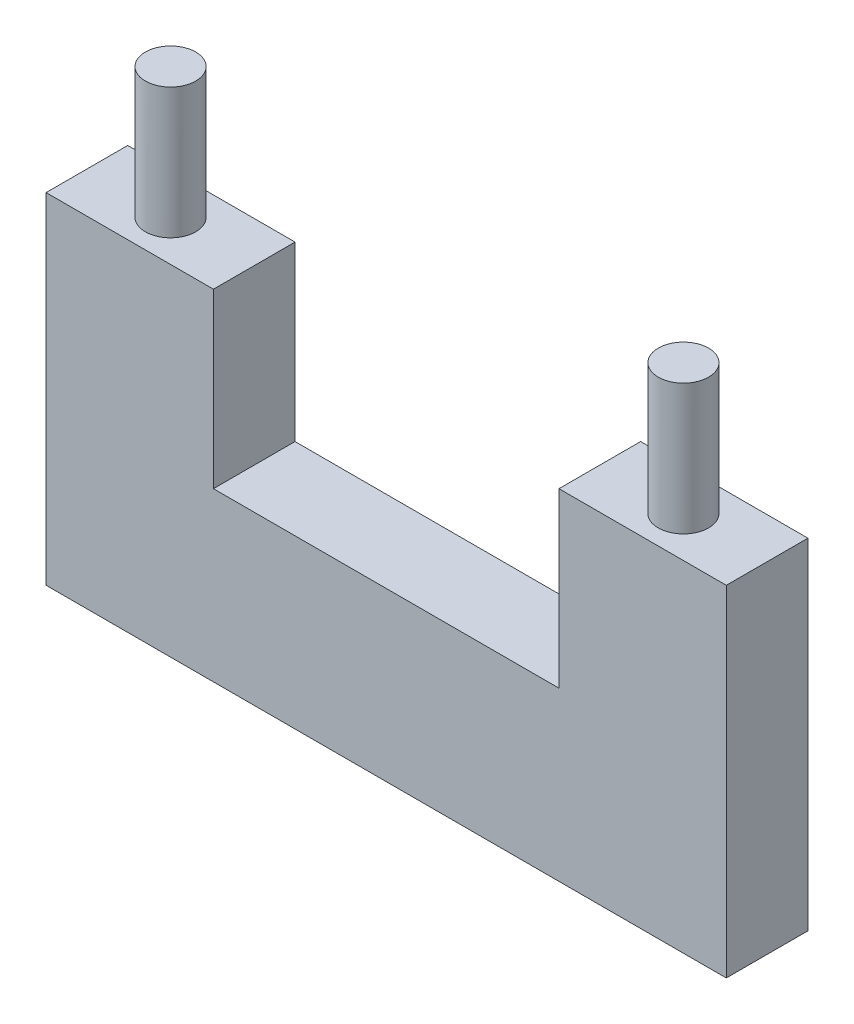
ISO-10303-21;
HEADER;
FILE_DESCRIPTION(('STEP AP214'),'2;1');
FILE_NAME('part.step','',(''),(''),'','','');
FILE_SCHEMA(('AUTOMOTIVE_DESIGN { 1 0 10303 214 1 1 1 1 }'));
ENDSEC;
DATA;
#1=APPLICATION_CONTEXT('core data for automotive mechanical design processes');
#2=APPLICATION_PROTOCOL_DEFINITION('international standard','automotive_design',2000,#1);
#3=PRODUCT_CONTEXT('',#1,'mechanical');
#4=PRODUCT('Part','Part','',(#3));
#5=PRODUCT_RELATED_PRODUCT_CATEGORY('part','',(#4));
#6=PRODUCT_DEFINITION_FORMATION('','',#4);
#7=PRODUCT_DEFINITION_CONTEXT('part definition',#1,'design');
#8=PRODUCT_DEFINITION('design','',#6,#7);
#9=PRODUCT_DEFINITION_SHAPE('','',#8);
#10=(LENGTH_UNIT() NAMED_UNIT(*) SI_UNIT(.MILLI.,.METRE.));
#11=(NAMED_UNIT(*) PLANE_ANGLE_UNIT() SI_UNIT($,.RADIAN.));
#12=(NAMED_UNIT(*) SI_UNIT($,.STERADIAN.) SOLID_ANGLE_UNIT());
#13=UNCERTAINTY_MEASURE_WITH_UNIT(LENGTH_MEASURE(1.E-05),#10,'distance_accuracy_value','');
#14=(GEOMETRIC_REPRESENTATION_CONTEXT(3) GLOBAL_UNCERTAINTY_ASSIGNED_CONTEXT((#13)) GLOBAL_UNIT_ASSIGNED_CONTEXT((#10,
#11,#12)) REPRESENTATION_CONTEXT('',''));
#15=CARTESIAN_POINT('',(0.,0.,0.));
#16=DIRECTION('',(0.,0.,1.));
#17=DIRECTION('',(1.,0.,0.));
#18=AXIS2_PLACEMENT_3D('',#15,#16,#17);
#19=CARTESIAN_POINT('',(-12.5,6.25,3.));
#20=DIRECTION('',(0.,-1.,0.));
#21=DIRECTION('',(0.,0.,-1.));
#22=AXIS2_PLACEMENT_3D('',#19,#20,#21);
#23=PLANE('',#22);
#24=CARTESIAN_POINT('',(-9.425,6.25,1.5));
#25=DIRECTION('',(0.,-1.,0.));
#26=DIRECTION('',(0.,0.,-1.));
#27=AXIS2_PLACEMENT_3D('',#24,#25,#26);
#28=CIRCLE('',#27,0.925000000000001);
#29=CARTESIAN_POINT('',(-9.425,6.25,0.574999999999999));
#30=VERTEX_POINT('',#29);
#31=EDGE_CURVE('E48',#30,#30,#28,.F.);
#32=ORIENTED_EDGE('',*,*,#31,.F.);
#33=EDGE_LOOP('',(#32));
#34=FACE_BOUND('',#33,.T.);
#35=DIRECTION('',(-1.,0.,0.));
#36=VECTOR('',#35,1.);
#37=CARTESIAN_POINT('',(-12.5,6.25,3.));
#38=LINE('',#37,#36);
#39=CARTESIAN_POINT('',(-6.35,6.25,3.));
#40=VERTEX_POINT('',#39);
#41=CARTESIAN_POINT('',(-12.5,6.25,3.));
#42=VERTEX_POINT('',#41);
#43=EDGE_CURVE('E167',#40,#42,#38,.T.);
#44=ORIENTED_EDGE('',*,*,#43,.F.);
#45=DIRECTION('',(0.,0.,1.));
#46=VECTOR('',#45,1.);
#47=CARTESIAN_POINT('',(-6.35,6.25,0.));
#48=LINE('',#47,#46);
#49=CARTESIAN_POINT('',(-6.35,6.25,0.));
#50=VERTEX_POINT('',#49);
#51=EDGE_CURVE('E155',#50,#40,#48,.T.);
#52=ORIENTED_EDGE('',*,*,#51,.F.);
#53=DIRECTION('',(-1.,0.,0.));
#54=VECTOR('',#53,1.);
#55=CARTESIAN_POINT('',(-12.5,6.25,0.));
#56=LINE('',#55,#54);
#57=CARTESIAN_POINT('',(-12.5,6.25,0.));
#58=VERTEX_POINT('',#57);
#59=EDGE_CURVE('E138',#50,#58,#56,.T.);
#60=ORIENTED_EDGE('',*,*,#59,.T.);
#61=DIRECTION('',(0.,0.,-1.));
#62=VECTOR('',#61,1.);
#63=CARTESIAN_POINT('',(-12.5,6.25,3.));
#64=LINE('',#63,#62);
#65=EDGE_CURVE('E193',#42,#58,#64,.T.);
#66=ORIENTED_EDGE('',*,*,#65,.F.);
#67=EDGE_LOOP('',(#44,#52,#60,#66));
#68=FACE_BOUND('',#67,.T.);
#69=ADVANCED_FACE('F39',(#34,#68),#23,.F.);
#70=CARTESIAN_POINT('',(12.5,6.25,3.));
#71=DIRECTION('',(-1.,0.,0.));
#72=DIRECTION('',(0.,0.,1.));
#73=AXIS2_PLACEMENT_3D('',#70,#71,#72);
#74=PLANE('',#73);
#75=DIRECTION('',(0.,1.,0.));
#76=VECTOR('',#75,1.);
#77=CARTESIAN_POINT('',(12.5,6.25,0.));
#78=LINE('',#77,#76);
#79=CARTESIAN_POINT('',(12.5,-6.25,0.));
#80=VERTEX_POINT('',#79);
#81=CARTESIAN_POINT('',(12.5,6.25,0.));
#82=VERTEX_POINT('',#81);
#83=EDGE_CURVE('E158',#80,#82,#78,.T.);
#84=ORIENTED_EDGE('',*,*,#83,.T.);
#85=DIRECTION('',(0.,0.,-1.));
#86=VECTOR('',#85,1.);
#87=CARTESIAN_POINT('',(12.5,6.25,3.));
#88=LINE('',#87,#86);
#89=CARTESIAN_POINT('',(12.5,6.25,3.));
#90=VERTEX_POINT('',#89);
#91=EDGE_CURVE('E197',#90,#82,#88,.T.);
#92=ORIENTED_EDGE('',*,*,#91,.F.);
#93=DIRECTION('',(0.,1.,0.));
#94=VECTOR('',#93,1.);
#95=CARTESIAN_POINT('',(12.5,6.25,3.));
#96=LINE('',#95,#94);
#97=CARTESIAN_POINT('',(12.5,-6.25,3.));
#98=VERTEX_POINT('',#97);
#99=EDGE_CURVE('E164',#98,#90,#96,.T.);
#100=ORIENTED_EDGE('',*,*,#99,.F.);
#101=DIRECTION('',(0.,0.,-1.));
#102=VECTOR('',#101,1.);
#103=CARTESIAN_POINT('',(12.5,-6.25,3.));
#104=LINE('',#103,#102);
#105=EDGE_CURVE('E175',#98,#80,#104,.T.);
#106=ORIENTED_EDGE('',*,*,#105,.T.);
#107=EDGE_LOOP('',(#84,#92,#100,#106));
#108=FACE_BOUND('',#107,.T.);
#109=ADVANCED_FACE('F41',(#108),#74,.F.);
#110=CARTESIAN_POINT('',(9.425,6.25,1.5));
#111=DIRECTION('',(0.,-1.,0.));
#112=DIRECTION('',(0.,0.,-1.));
#113=AXIS2_PLACEMENT_3D('',#110,#111,#112);
#114=CIRCLE('',#113,0.925000000000001);
#115=CARTESIAN_POINT('',(9.425,6.25,0.574999999999999));
#116=VERTEX_POINT('',#115);
#117=EDGE_CURVE('E11',#116,#116,#114,.F.);
#118=ORIENTED_EDGE('',*,*,#117,.F.);
#119=EDGE_LOOP('',(#118));
#120=FACE_BOUND('',#119,.T.);
#121=CARTESIAN_POINT('',(6.35,6.25,0.));
#122=VERTEX_POINT('',#121);
#123=EDGE_CURVE('E179',#82,#122,#56,.T.);
#124=ORIENTED_EDGE('',*,*,#123,.T.);
#125=DIRECTION('',(0.,0.,1.));
#126=VECTOR('',#125,1.);
#127=CARTESIAN_POINT('',(6.35,6.25,0.));
#128=LINE('',#127,#126);
#129=CARTESIAN_POINT('',(6.35,6.25,3.));
#130=VERTEX_POINT('',#129);
#131=EDGE_CURVE('E159',#122,#130,#128,.T.);
#132=ORIENTED_EDGE('',*,*,#131,.T.);
#133=EDGE_CURVE('E93',#90,#130,#38,.T.);
#134=ORIENTED_EDGE('',*,*,#133,.F.);
#135=ORIENTED_EDGE('',*,*,#91,.T.);
#136=EDGE_LOOP('',(#124,#132,#134,#135));
#137=FACE_BOUND('',#136,.T.);
#138=ADVANCED_FACE('F207',(#120,#137),#23,.F.);
#139=CARTESIAN_POINT('',(-12.5,6.25,3.));
#140=DIRECTION('',(1.,0.,0.));
#141=DIRECTION('',(0.,1.,0.));
#142=AXIS2_PLACEMENT_3D('',#139,#140,#141);
#143=PLANE('',#142);
#144=DIRECTION('',(0.,-1.,0.));
#145=VECTOR('',#144,1.);
#146=CARTESIAN_POINT('',(-12.5,6.25,0.));
#147=LINE('',#146,#145);
#148=CARTESIAN_POINT('',(-12.5,-6.25,0.));
#149=VERTEX_POINT('',#148);
#150=EDGE_CURVE('E183',#58,#149,#147,.T.);
#151=ORIENTED_EDGE('',*,*,#150,.T.);
#152=DIRECTION('',(0.,0.,-1.));
#153=VECTOR('',#152,1.);
#154=CARTESIAN_POINT('',(-12.5,-6.25,3.));
#155=LINE('',#154,#153);
#156=CARTESIAN_POINT('',(-12.5,-6.25,3.));
#157=VERTEX_POINT('',#156);
#158=EDGE_CURVE('E190',#157,#149,#155,.T.);
#159=ORIENTED_EDGE('',*,*,#158,.F.);
#160=DIRECTION('',(0.,-1.,0.));
#161=VECTOR('',#160,1.);
#162=CARTESIAN_POINT('',(-12.5,6.25,3.));
#163=LINE('',#162,#161);
#164=EDGE_CURVE('E170',#42,#157,#163,.T.);
#165=ORIENTED_EDGE('',*,*,#164,.F.);
#166=ORIENTED_EDGE('',*,*,#65,.T.);
#167=EDGE_LOOP('',(#151,#159,#165,#166));
#168=FACE_BOUND('',#167,.T.);
#169=ADVANCED_FACE('F214',(#168),#143,.F.);
#170=CARTESIAN_POINT('',(-12.5,-6.25,3.));
#171=DIRECTION('',(0.,1.,0.));
#172=DIRECTION('',(0.,0.,1.));
#173=AXIS2_PLACEMENT_3D('',#170,#171,#172);
#174=PLANE('',#173);
#175=DIRECTION('',(1.,0.,0.));
#176=VECTOR('',#175,1.);
#177=CARTESIAN_POINT('',(-12.5,-6.25,0.));
#178=LINE('',#177,#176);
#179=EDGE_CURVE('E85',#149,#80,#178,.T.);
#180=ORIENTED_EDGE('',*,*,#179,.T.);
#181=ORIENTED_EDGE('',*,*,#105,.F.);
#182=DIRECTION('',(1.,0.,0.));
#183=VECTOR('',#182,1.);
#184=CARTESIAN_POINT('',(-12.5,-6.25,3.));
#185=LINE('',#184,#183);
#186=EDGE_CURVE('E64',#157,#98,#185,.T.);
#187=ORIENTED_EDGE('',*,*,#186,.F.);
#188=ORIENTED_EDGE('',*,*,#158,.T.);
#189=EDGE_LOOP('',(#180,#181,#187,#188));
#190=FACE_BOUND('',#189,.T.);
#191=ADVANCED_FACE('F220',(#190),#174,.F.);
#192=CARTESIAN_POINT('',(0.,0.,3.));
#193=DIRECTION('',(0.,0.,1.));
#194=DIRECTION('',(1.,0.,0.));
#195=AXIS2_PLACEMENT_3D('',#192,#193,#194);
#196=PLANE('',#195);
#197=DIRECTION('',(0.,-1.,0.));
#198=VECTOR('',#197,1.);
#199=CARTESIAN_POINT('',(-6.35,6.25,3.));
#200=LINE('',#199,#198);
#201=CARTESIAN_POINT('',(-6.35,-0.0999999999999985,3.));
#202=VERTEX_POINT('',#201);
#203=EDGE_CURVE('E122',#40,#202,#200,.T.);
#204=ORIENTED_EDGE('',*,*,#203,.F.);
#205=ORIENTED_EDGE('',*,*,#43,.T.);
#206=ORIENTED_EDGE('',*,*,#164,.T.);
#207=ORIENTED_EDGE('',*,*,#186,.T.);
#208=ORIENTED_EDGE('',*,*,#99,.T.);
#209=ORIENTED_EDGE('',*,*,#133,.T.);
#210=DIRECTION('',(0.,1.,0.));
#211=VECTOR('',#210,1.);
#212=CARTESIAN_POINT('',(6.35,6.25,3.));
#213=LINE('',#212,#211);
#214=CARTESIAN_POINT('',(6.35,-0.0999999999999985,3.));
#215=VERTEX_POINT('',#214);
#216=EDGE_CURVE('E140',#215,#130,#213,.T.);
#217=ORIENTED_EDGE('',*,*,#216,.F.);
#218=DIRECTION('',(1.,0.,0.));
#219=VECTOR('',#218,1.);
#220=CARTESIAN_POINT('',(-6.35,-0.0999999999999985,3.));
#221=LINE('',#220,#219);
#222=EDGE_CURVE('E143',#202,#215,#221,.T.);
#223=ORIENTED_EDGE('',*,*,#222,.F.);
#224=EDGE_LOOP('',(#204,#205,#206,#207,#208,#209,#217,#223));
#225=FACE_BOUND('',#224,.T.);
#226=ADVANCED_FACE('F222',(#225),#196,.T.);
#227=CARTESIAN_POINT('',(0.,0.,0.));
#228=DIRECTION('',(0.,0.,1.));
#229=DIRECTION('',(1.,0.,0.));
#230=AXIS2_PLACEMENT_3D('',#227,#228,#229);
#231=PLANE('',#230);
#232=ORIENTED_EDGE('',*,*,#59,.F.);
#233=DIRECTION('',(0.,-1.,0.));
#234=VECTOR('',#233,1.);
#235=CARTESIAN_POINT('',(-6.35,6.25,0.));
#236=LINE('',#235,#234);
#237=CARTESIAN_POINT('',(-6.35,-0.0999999999999985,0.));
#238=VERTEX_POINT('',#237);
#239=EDGE_CURVE('E119',#50,#238,#236,.T.);
#240=ORIENTED_EDGE('',*,*,#239,.T.);
#241=DIRECTION('',(1.,0.,0.));
#242=VECTOR('',#241,1.);
#243=CARTESIAN_POINT('',(-6.35,-0.0999999999999985,0.));
#244=LINE('',#243,#242);
#245=CARTESIAN_POINT('',(6.35,-0.0999999999999985,0.));
#246=VERTEX_POINT('',#245);
#247=EDGE_CURVE('E130',#238,#246,#244,.T.);
#248=ORIENTED_EDGE('',*,*,#247,.T.);
#249=DIRECTION('',(0.,1.,0.));
#250=VECTOR('',#249,1.);
#251=CARTESIAN_POINT('',(6.35,6.25,0.));
#252=LINE('',#251,#250);
#253=EDGE_CURVE('E55',#246,#122,#252,.T.);
#254=ORIENTED_EDGE('',*,*,#253,.T.);
#255=ORIENTED_EDGE('',*,*,#123,.F.);
#256=ORIENTED_EDGE('',*,*,#83,.F.);
#257=ORIENTED_EDGE('',*,*,#179,.F.);
#258=ORIENTED_EDGE('',*,*,#150,.F.);
#259=EDGE_LOOP('',(#232,#240,#248,#254,#255,#256,#257,#258));
#260=FACE_BOUND('',#259,.T.);
#261=ADVANCED_FACE('F136',(#260),#231,.F.);
#262=CARTESIAN_POINT('',(-6.35,6.25,0.));
#263=DIRECTION('',(-1.,0.,0.));
#264=DIRECTION('',(0.,-1.,0.));
#265=AXIS2_PLACEMENT_3D('',#262,#263,#264);
#266=PLANE('',#265);
#267=ORIENTED_EDGE('',*,*,#203,.T.);
#268=DIRECTION('',(0.,0.,1.));
#269=VECTOR('',#268,1.);
#270=CARTESIAN_POINT('',(-6.35,-0.0999999999999985,0.));
#271=LINE('',#270,#269);
#272=EDGE_CURVE('E115',#238,#202,#271,.T.);
#273=ORIENTED_EDGE('',*,*,#272,.F.);
#274=ORIENTED_EDGE('',*,*,#239,.F.);
#275=ORIENTED_EDGE('',*,*,#51,.T.);
#276=EDGE_LOOP('',(#267,#273,#274,#275));
#277=FACE_BOUND('',#276,.T.);
#278=ADVANCED_FACE('F117',(#277),#266,.F.);
#279=CARTESIAN_POINT('',(6.35,6.25,0.));
#280=DIRECTION('',(1.,0.,0.));
#281=DIRECTION('',(0.,1.,0.));
#282=AXIS2_PLACEMENT_3D('',#279,#280,#281);
#283=PLANE('',#282);
#284=ORIENTED_EDGE('',*,*,#216,.T.);
#285=ORIENTED_EDGE('',*,*,#131,.F.);
#286=ORIENTED_EDGE('',*,*,#253,.F.);
#287=DIRECTION('',(0.,0.,1.));
#288=VECTOR('',#287,1.);
#289=CARTESIAN_POINT('',(6.35,-0.0999999999999985,0.));
#290=LINE('',#289,#288);
#291=EDGE_CURVE('E127',#246,#215,#290,.T.);
#292=ORIENTED_EDGE('',*,*,#291,.T.);
#293=EDGE_LOOP('',(#284,#285,#286,#292));
#294=FACE_BOUND('',#293,.T.);
#295=ADVANCED_FACE('F238',(#294),#283,.F.);
#296=CARTESIAN_POINT('',(-6.35,-0.0999999999999985,0.));
#297=DIRECTION('',(0.,-1.,0.));
#298=DIRECTION('',(0.,0.,-1.));
#299=AXIS2_PLACEMENT_3D('',#296,#297,#298);
#300=PLANE('',#299);
#301=ORIENTED_EDGE('',*,*,#222,.T.);
#302=ORIENTED_EDGE('',*,*,#291,.F.);
#303=ORIENTED_EDGE('',*,*,#247,.F.);
#304=ORIENTED_EDGE('',*,*,#272,.T.);
#305=EDGE_LOOP('',(#301,#302,#303,#304));
#306=FACE_BOUND('',#305,.T.);
#307=ADVANCED_FACE('F131',(#306),#300,.F.);
#308=CARTESIAN_POINT('',(-9.425,11.05,1.5));
#309=DIRECTION('',(0.,-1.,0.));
#310=DIRECTION('',(0.,0.,-1.));
#311=AXIS2_PLACEMENT_3D('',#308,#309,#310);
#312=CYLINDRICAL_SURFACE('',#311,0.925000000000001);
#313=CARTESIAN_POINT('',(-9.425,11.05,1.5));
#314=DIRECTION('',(0.,1.,0.));
#315=DIRECTION('',(0.,0.,1.));
#316=AXIS2_PLACEMENT_3D('',#313,#314,#315);
#317=CIRCLE('',#316,0.925000000000001);
#318=CARTESIAN_POINT('',(-9.425,11.05,2.425));
#319=VERTEX_POINT('',#318);
#320=EDGE_CURVE('E146',#319,#319,#317,.T.);
#321=ORIENTED_EDGE('',*,*,#320,.F.);
#322=EDGE_LOOP('',(#321));
#323=FACE_BOUND('',#322,.T.);
#324=ORIENTED_EDGE('',*,*,#31,.T.);
#325=EDGE_LOOP('',(#324));
#326=FACE_BOUND('',#325,.T.);
#327=ADVANCED_FACE('F203',(#323,#326),#312,.T.);
#328=CARTESIAN_POINT('',(-9.425,11.05,1.5));
#329=DIRECTION('',(0.,1.,0.));
#330=DIRECTION('',(0.,0.,1.));
#331=AXIS2_PLACEMENT_3D('',#328,#329,#330);
#332=PLANE('',#331);
#333=ORIENTED_EDGE('',*,*,#320,.T.);
#334=EDGE_LOOP('',(#333));
#335=FACE_BOUND('',#334,.T.);
#336=ADVANCED_FACE('F250',(#335),#332,.T.);
#337=CARTESIAN_POINT('',(9.425,11.05,1.5));
#338=DIRECTION('',(0.,-1.,0.));
#339=DIRECTION('',(0.,0.,-1.));
#340=AXIS2_PLACEMENT_3D('',#337,#338,#339);
#341=CYLINDRICAL_SURFACE('',#340,0.925000000000001);
#342=CARTESIAN_POINT('',(9.425,11.05,1.5));
#343=DIRECTION('',(0.,1.,0.));
#344=DIRECTION('',(0.,0.,1.));
#345=AXIS2_PLACEMENT_3D('',#342,#343,#344);
#346=CIRCLE('',#345,0.925000000000001);
#347=CARTESIAN_POINT('',(9.425,11.05,2.425));
#348=VERTEX_POINT('',#347);
#349=EDGE_CURVE('E266',#348,#348,#346,.T.);
#350=ORIENTED_EDGE('',*,*,#349,.F.);
#351=EDGE_LOOP('',(#350));
#352=FACE_BOUND('',#351,.T.);
#353=ORIENTED_EDGE('',*,*,#117,.T.);
#354=EDGE_LOOP('',(#353));
#355=FACE_BOUND('',#354,.T.);
#356=ADVANCED_FACE('F254',(#352,#355),#341,.T.);
#357=CARTESIAN_POINT('',(9.425,11.05,1.5));
#358=DIRECTION('',(0.,1.,0.));
#359=DIRECTION('',(0.,0.,1.));
#360=AXIS2_PLACEMENT_3D('',#357,#358,#359);
#361=PLANE('',#360);
#362=ORIENTED_EDGE('',*,*,#349,.T.);
#363=EDGE_LOOP('',(#362));
#364=FACE_BOUND('',#363,.T.);
#365=ADVANCED_FACE('F258',(#364),#361,.T.);
#366=CLOSED_SHELL('',(#69,#109,#138,#169,#191,#226,#261,#278,#295,#307,#327,#336,#356,#365));
#367=MANIFOLD_SOLID_BREP('B2',#366);
#368=ADVANCED_BREP_SHAPE_REPRESENTATION('',(#18,#367),#14);
#369=SHAPE_DEFINITION_REPRESENTATION(#9,#368);
ENDSEC;
END-ISO-10303-21;
